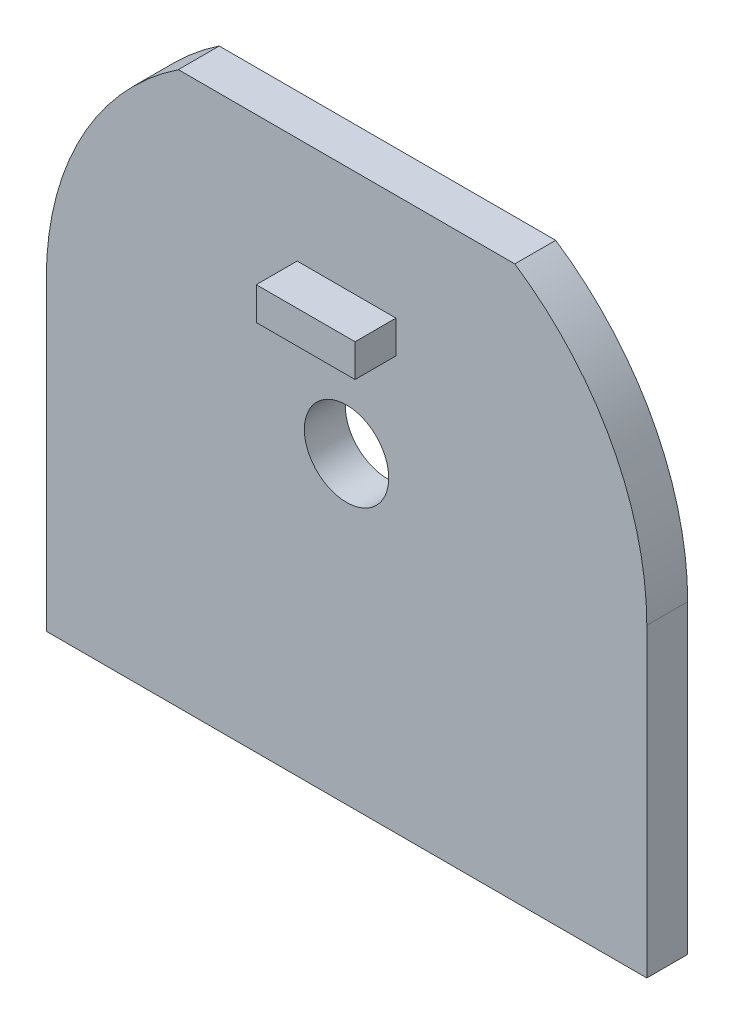
ISO-10303-21;
HEADER;
FILE_DESCRIPTION(('STEP AP214'),'2;1');
FILE_NAME('part.step','',(''),(''),'','','');
FILE_SCHEMA(('AUTOMOTIVE_DESIGN { 1 0 10303 214 1 1 1 1 }'));
ENDSEC;
DATA;
#1=APPLICATION_CONTEXT('core data for automotive mechanical design processes');
#2=APPLICATION_PROTOCOL_DEFINITION('international standard','automotive_design',2000,#1);
#3=PRODUCT_CONTEXT('',#1,'mechanical');
#4=PRODUCT('Part','Part','',(#3));
#5=PRODUCT_RELATED_PRODUCT_CATEGORY('part','',(#4));
#6=PRODUCT_DEFINITION_FORMATION('','',#4);
#7=PRODUCT_DEFINITION_CONTEXT('part definition',#1,'design');
#8=PRODUCT_DEFINITION('design','',#6,#7);
#9=PRODUCT_DEFINITION_SHAPE('','',#8);
#10=(LENGTH_UNIT() NAMED_UNIT(*) SI_UNIT(.MILLI.,.METRE.));
#11=(NAMED_UNIT(*) PLANE_ANGLE_UNIT() SI_UNIT($,.RADIAN.));
#12=(NAMED_UNIT(*) SI_UNIT($,.STERADIAN.) SOLID_ANGLE_UNIT());
#13=UNCERTAINTY_MEASURE_WITH_UNIT(LENGTH_MEASURE(1.E-05),#10,'distance_accuracy_value','');
#14=(GEOMETRIC_REPRESENTATION_CONTEXT(3) GLOBAL_UNCERTAINTY_ASSIGNED_CONTEXT((#13)) GLOBAL_UNIT_ASSIGNED_CONTEXT((#10,
#11,#12)) REPRESENTATION_CONTEXT('',''));
#15=CARTESIAN_POINT('',(0.,0.,0.));
#16=DIRECTION('',(0.,0.,1.));
#17=DIRECTION('',(1.,0.,0.));
#18=AXIS2_PLACEMENT_3D('',#15,#16,#17);
#19=CARTESIAN_POINT('',(-0.0614645717185849,0.599999941999997,0.79));
#20=DIRECTION('',(0.,0.,-1.));
#21=DIRECTION('',(-1.,0.,0.));
#22=AXIS2_PLACEMENT_3D('',#19,#20,#21);
#23=PLANE('',#22);
#24=CARTESIAN_POINT('',(0.,0.57116650110339,0.79));
#25=DIRECTION('',(0.,0.,1.));
#26=DIRECTION('',(1.,0.,0.));
#27=AXIS2_PLACEMENT_3D('',#24,#25,#26);
#28=CIRCLE('',#27,0.815000000000001);
#29=CARTESIAN_POINT('',(-0.815000000000001,0.57116650110339,0.79));
#30=VERTEX_POINT('',#29);
#31=EDGE_CURVE('E146',#30,#30,#28,.T.);
#32=ORIENTED_EDGE('',*,*,#31,.F.);
#33=EDGE_LOOP('',(#32));
#34=FACE_BOUND('',#33,.T.);
#35=DIRECTION('',(0.,1.,0.));
#36=VECTOR('',#35,1.);
#37=CARTESIAN_POINT('',(5.8,0.599999941999998,0.79));
#38=LINE('',#37,#36);
#39=CARTESIAN_POINT('',(5.8,-5.299999942,0.79));
#40=VERTEX_POINT('',#39);
#41=CARTESIAN_POINT('',(5.8,0.599999941999998,0.79));
#42=VERTEX_POINT('',#41);
#43=EDGE_CURVE('E156',#40,#42,#38,.T.);
#44=ORIENTED_EDGE('',*,*,#43,.T.);
#45=CARTESIAN_POINT('',(0.0614645717185833,0.599999941999997,0.79));
#46=DIRECTION('',(0.,0.,1.));
#47=DIRECTION('',(1.,0.,0.));
#48=AXIS2_PLACEMENT_3D('',#45,#46,#47);
#49=CIRCLE('',#48,5.73853542828142);
#50=CARTESIAN_POINT('',(3.249999977,5.37116655310339,0.79));
#51=VERTEX_POINT('',#50);
#52=EDGE_CURVE('E160',#42,#51,#49,.T.);
#53=ORIENTED_EDGE('',*,*,#52,.T.);
#54=DIRECTION('',(-1.,0.,0.));
#55=VECTOR('',#54,1.);
#56=CARTESIAN_POINT('',(-3.249999977,5.37116655310339,0.79));
#57=LINE('',#56,#55);
#58=CARTESIAN_POINT('',(-3.249999977,5.37116655310339,0.79));
#59=VERTEX_POINT('',#58);
#60=EDGE_CURVE('E164',#51,#59,#57,.T.);
#61=ORIENTED_EDGE('',*,*,#60,.T.);
#62=CARTESIAN_POINT('',(-0.0614645717185849,0.599999941999997,0.79));
#63=DIRECTION('',(0.,0.,1.));
#64=DIRECTION('',(-1.,0.,0.));
#65=AXIS2_PLACEMENT_3D('',#62,#63,#64);
#66=CIRCLE('',#65,5.73853542828142);
#67=CARTESIAN_POINT('',(-5.8,0.599999941999997,0.79));
#68=VERTEX_POINT('',#67);
#69=EDGE_CURVE('E167',#59,#68,#66,.T.);
#70=ORIENTED_EDGE('',*,*,#69,.T.);
#71=DIRECTION('',(0.,-1.,0.));
#72=VECTOR('',#71,1.);
#73=CARTESIAN_POINT('',(-5.8,0.599999941999997,0.79));
#74=LINE('',#73,#72);
#75=CARTESIAN_POINT('',(-5.8,-5.299999942,0.79));
#76=VERTEX_POINT('',#75);
#77=EDGE_CURVE('E170',#68,#76,#74,.T.);
#78=ORIENTED_EDGE('',*,*,#77,.T.);
#79=DIRECTION('',(1.,0.,0.));
#80=VECTOR('',#79,1.);
#81=CARTESIAN_POINT('',(5.8,-5.299999942,0.79));
#82=LINE('',#81,#80);
#83=EDGE_CURVE('E173',#76,#40,#82,.T.);
#84=ORIENTED_EDGE('',*,*,#83,.T.);
#85=EDGE_LOOP('',(#44,#53,#61,#70,#78,#84));
#86=FACE_BOUND('',#85,.T.);
#87=DIRECTION('',(0.,1.,0.));
#88=VECTOR('',#87,1.);
#89=CARTESIAN_POINT('',(0.954050135205686,2.68359858522657,0.79));
#90=LINE('',#89,#88);
#91=CARTESIAN_POINT('',(0.954050135205686,2.68359858522657,0.79));
#92=VERTEX_POINT('',#91);
#93=CARTESIAN_POINT('',(0.954050135205687,3.31640141477343,0.79));
#94=VERTEX_POINT('',#93);
#95=EDGE_CURVE('E139',#92,#94,#90,.T.);
#96=ORIENTED_EDGE('',*,*,#95,.F.);
#97=DIRECTION('',(1.,0.,0.));
#98=VECTOR('',#97,1.);
#99=CARTESIAN_POINT('',(-0.954050135205687,2.68359858522657,0.79));
#100=LINE('',#99,#98);
#101=CARTESIAN_POINT('',(-0.954050135205687,2.68359858522657,0.79));
#102=VERTEX_POINT('',#101);
#103=EDGE_CURVE('E136',#102,#92,#100,.T.);
#104=ORIENTED_EDGE('',*,*,#103,.F.);
#105=DIRECTION('',(0.,-1.,0.));
#106=VECTOR('',#105,1.);
#107=CARTESIAN_POINT('',(-0.954050135205687,2.68359858522657,0.79));
#108=LINE('',#107,#106);
#109=CARTESIAN_POINT('',(-0.954050135205687,3.31640141477343,0.79));
#110=VERTEX_POINT('',#109);
#111=EDGE_CURVE('E60',#110,#102,#108,.T.);
#112=ORIENTED_EDGE('',*,*,#111,.F.);
#113=DIRECTION('',(-1.,0.,0.));
#114=VECTOR('',#113,1.);
#115=CARTESIAN_POINT('',(-0.954050135205687,3.31640141477343,0.79));
#116=LINE('',#115,#114);
#117=EDGE_CURVE('E55',#94,#110,#116,.T.);
#118=ORIENTED_EDGE('',*,*,#117,.F.);
#119=EDGE_LOOP('',(#96,#104,#112,#118));
#120=FACE_BOUND('',#119,.T.);
#121=ADVANCED_FACE('F39',(#34,#86,#120),#23,.F.);
#122=CARTESIAN_POINT('',(-0.0614645717185849,0.599999941999997,0.));
#123=DIRECTION('',(0.,0.,-1.));
#124=DIRECTION('',(-1.,0.,0.));
#125=AXIS2_PLACEMENT_3D('',#122,#123,#124);
#126=PLANE('',#125);
#127=DIRECTION('',(0.,1.,0.));
#128=VECTOR('',#127,1.);
#129=CARTESIAN_POINT('',(5.8,0.599999941999998,0.));
#130=LINE('',#129,#128);
#131=CARTESIAN_POINT('',(5.8,-5.299999942,0.));
#132=VERTEX_POINT('',#131);
#133=CARTESIAN_POINT('',(5.8,0.599999941999998,0.));
#134=VERTEX_POINT('',#133);
#135=EDGE_CURVE('E154',#132,#134,#130,.T.);
#136=ORIENTED_EDGE('',*,*,#135,.F.);
#137=DIRECTION('',(1.,0.,0.));
#138=VECTOR('',#137,1.);
#139=CARTESIAN_POINT('',(5.8,-5.299999942,0.));
#140=LINE('',#139,#138);
#141=CARTESIAN_POINT('',(-5.8,-5.299999942,0.));
#142=VERTEX_POINT('',#141);
#143=EDGE_CURVE('E161',#142,#132,#140,.T.);
#144=ORIENTED_EDGE('',*,*,#143,.F.);
#145=DIRECTION('',(0.,-1.,0.));
#146=VECTOR('',#145,1.);
#147=CARTESIAN_POINT('',(-5.8,0.599999941999997,0.));
#148=LINE('',#147,#146);
#149=CARTESIAN_POINT('',(-5.8,0.599999941999997,0.));
#150=VERTEX_POINT('',#149);
#151=EDGE_CURVE('E189',#150,#142,#148,.T.);
#152=ORIENTED_EDGE('',*,*,#151,.F.);
#153=CARTESIAN_POINT('',(-0.0614645717185849,0.599999941999997,0.));
#154=DIRECTION('',(0.,0.,1.));
#155=DIRECTION('',(-1.,0.,0.));
#156=AXIS2_PLACEMENT_3D('',#153,#154,#155);
#157=CIRCLE('',#156,5.73853542828142);
#158=CARTESIAN_POINT('',(-3.249999977,5.37116655310339,0.));
#159=VERTEX_POINT('',#158);
#160=EDGE_CURVE('E186',#159,#150,#157,.T.);
#161=ORIENTED_EDGE('',*,*,#160,.F.);
#162=DIRECTION('',(-1.,0.,0.));
#163=VECTOR('',#162,1.);
#164=CARTESIAN_POINT('',(-3.249999977,5.37116655310339,0.));
#165=LINE('',#164,#163);
#166=CARTESIAN_POINT('',(3.249999977,5.37116655310339,0.));
#167=VERTEX_POINT('',#166);
#168=EDGE_CURVE('E183',#167,#159,#165,.T.);
#169=ORIENTED_EDGE('',*,*,#168,.F.);
#170=CARTESIAN_POINT('',(0.0614645717185833,0.599999941999997,0.));
#171=DIRECTION('',(0.,0.,1.));
#172=DIRECTION('',(1.,0.,0.));
#173=AXIS2_PLACEMENT_3D('',#170,#171,#172);
#174=CIRCLE('',#173,5.73853542828142);
#175=EDGE_CURVE('E180',#134,#167,#174,.T.);
#176=ORIENTED_EDGE('',*,*,#175,.F.);
#177=EDGE_LOOP('',(#136,#144,#152,#161,#169,#176));
#178=FACE_BOUND('',#177,.T.);
#179=CARTESIAN_POINT('',(0.,0.57116650110339,0.));
#180=DIRECTION('',(0.,0.,1.));
#181=DIRECTION('',(1.,0.,0.));
#182=AXIS2_PLACEMENT_3D('',#179,#180,#181);
#183=CIRCLE('',#182,0.815000000000001);
#184=CARTESIAN_POINT('',(-0.815000000000001,0.57116650110339,0.));
#185=VERTEX_POINT('',#184);
#186=EDGE_CURVE('E141',#185,#185,#183,.T.);
#187=ORIENTED_EDGE('',*,*,#186,.T.);
#188=EDGE_LOOP('',(#187));
#189=FACE_BOUND('',#188,.T.);
#190=ADVANCED_FACE('F220',(#178,#189),#126,.T.);
#191=CARTESIAN_POINT('',(5.8,0.599999941999998,0.79));
#192=DIRECTION('',(-1.,0.,0.));
#193=DIRECTION('',(0.,-1.,0.));
#194=AXIS2_PLACEMENT_3D('',#191,#192,#193);
#195=PLANE('',#194);
#196=ORIENTED_EDGE('',*,*,#135,.T.);
#197=DIRECTION('',(0.,0.,-1.));
#198=VECTOR('',#197,1.);
#199=CARTESIAN_POINT('',(5.8,0.599999941999998,0.79));
#200=LINE('',#199,#198);
#201=EDGE_CURVE('E11',#42,#134,#200,.T.);
#202=ORIENTED_EDGE('',*,*,#201,.F.);
#203=ORIENTED_EDGE('',*,*,#43,.F.);
#204=DIRECTION('',(0.,0.,-1.));
#205=VECTOR('',#204,1.);
#206=CARTESIAN_POINT('',(5.8,-5.299999942,0.79));
#207=LINE('',#206,#205);
#208=EDGE_CURVE('E176',#40,#132,#207,.T.);
#209=ORIENTED_EDGE('',*,*,#208,.T.);
#210=EDGE_LOOP('',(#196,#202,#203,#209));
#211=FACE_BOUND('',#210,.T.);
#212=ADVANCED_FACE('F41',(#211),#195,.F.);
#213=CARTESIAN_POINT('',(0.0614645717185833,0.599999941999997,0.79));
#214=DIRECTION('',(0.,0.,-1.));
#215=DIRECTION('',(-1.,0.,0.));
#216=AXIS2_PLACEMENT_3D('',#213,#214,#215);
#217=CYLINDRICAL_SURFACE('',#216,5.73853542828142);
#218=ORIENTED_EDGE('',*,*,#175,.T.);
#219=DIRECTION('',(0.,0.,-1.));
#220=VECTOR('',#219,1.);
#221=CARTESIAN_POINT('',(3.249999977,5.37116655310339,0.79));
#222=LINE('',#221,#220);
#223=EDGE_CURVE('E48',#51,#167,#222,.T.);
#224=ORIENTED_EDGE('',*,*,#223,.F.);
#225=ORIENTED_EDGE('',*,*,#52,.F.);
#226=ORIENTED_EDGE('',*,*,#201,.T.);
#227=EDGE_LOOP('',(#218,#224,#225,#226));
#228=FACE_BOUND('',#227,.T.);
#229=ADVANCED_FACE('F237',(#228),#217,.T.);
#230=CARTESIAN_POINT('',(-3.249999977,5.37116655310339,0.79));
#231=DIRECTION('',(0.,-1.,0.));
#232=DIRECTION('',(0.,0.,-1.));
#233=AXIS2_PLACEMENT_3D('',#230,#231,#232);
#234=PLANE('',#233);
#235=ORIENTED_EDGE('',*,*,#168,.T.);
#236=DIRECTION('',(0.,0.,-1.));
#237=VECTOR('',#236,1.);
#238=CARTESIAN_POINT('',(-3.249999977,5.37116655310339,0.79));
#239=LINE('',#238,#237);
#240=EDGE_CURVE('E205',#59,#159,#239,.T.);
#241=ORIENTED_EDGE('',*,*,#240,.F.);
#242=ORIENTED_EDGE('',*,*,#60,.F.);
#243=ORIENTED_EDGE('',*,*,#223,.T.);
#244=EDGE_LOOP('',(#235,#241,#242,#243));
#245=FACE_BOUND('',#244,.T.);
#246=ADVANCED_FACE('F214',(#245),#234,.F.);
#247=CARTESIAN_POINT('',(-0.0614645717185849,0.599999941999997,0.79));
#248=DIRECTION('',(0.,0.,-1.));
#249=DIRECTION('',(-1.,0.,0.));
#250=AXIS2_PLACEMENT_3D('',#247,#248,#249);
#251=CYLINDRICAL_SURFACE('',#250,5.73853542828142);
#252=ORIENTED_EDGE('',*,*,#160,.T.);
#253=DIRECTION('',(0.,0.,-1.));
#254=VECTOR('',#253,1.);
#255=CARTESIAN_POINT('',(-5.8,0.599999941999997,0.79));
#256=LINE('',#255,#254);
#257=EDGE_CURVE('E201',#68,#150,#256,.T.);
#258=ORIENTED_EDGE('',*,*,#257,.F.);
#259=ORIENTED_EDGE('',*,*,#69,.F.);
#260=ORIENTED_EDGE('',*,*,#240,.T.);
#261=EDGE_LOOP('',(#252,#258,#259,#260));
#262=FACE_BOUND('',#261,.T.);
#263=ADVANCED_FACE('F226',(#262),#251,.T.);
#264=CARTESIAN_POINT('',(-5.8,0.599999941999997,0.79));
#265=DIRECTION('',(1.,0.,0.));
#266=DIRECTION('',(0.,1.,0.));
#267=AXIS2_PLACEMENT_3D('',#264,#265,#266);
#268=PLANE('',#267);
#269=ORIENTED_EDGE('',*,*,#151,.T.);
#270=DIRECTION('',(0.,0.,-1.));
#271=VECTOR('',#270,1.);
#272=CARTESIAN_POINT('',(-5.8,-5.299999942,0.79));
#273=LINE('',#272,#271);
#274=EDGE_CURVE('E197',#76,#142,#273,.T.);
#275=ORIENTED_EDGE('',*,*,#274,.F.);
#276=ORIENTED_EDGE('',*,*,#77,.F.);
#277=ORIENTED_EDGE('',*,*,#257,.T.);
#278=EDGE_LOOP('',(#269,#275,#276,#277));
#279=FACE_BOUND('',#278,.T.);
#280=ADVANCED_FACE('F230',(#279),#268,.F.);
#281=CARTESIAN_POINT('',(5.8,-5.299999942,0.79));
#282=DIRECTION('',(0.,1.,0.));
#283=DIRECTION('',(-1.,0.,0.));
#284=AXIS2_PLACEMENT_3D('',#281,#282,#283);
#285=PLANE('',#284);
#286=ORIENTED_EDGE('',*,*,#143,.T.);
#287=ORIENTED_EDGE('',*,*,#208,.F.);
#288=ORIENTED_EDGE('',*,*,#83,.F.);
#289=ORIENTED_EDGE('',*,*,#274,.T.);
#290=EDGE_LOOP('',(#286,#287,#288,#289));
#291=FACE_BOUND('',#290,.T.);
#292=ADVANCED_FACE('F240',(#291),#285,.F.);
#293=CARTESIAN_POINT('',(0.,0.57116650110339,0.79));
#294=DIRECTION('',(0.,0.,-1.));
#295=DIRECTION('',(-1.,0.,0.));
#296=AXIS2_PLACEMENT_3D('',#293,#294,#295);
#297=CYLINDRICAL_SURFACE('',#296,0.815000000000001);
#298=CARTESIAN_POINT('',(-0.815000000000001,0.57116650110339,0.79));
#299=CARTESIAN_POINT('',(-0.815000000000001,0.57116650110339,0.781770833333333));
#300=CARTESIAN_POINT('',(-0.815000000000001,0.57116650110339,0.773541666666667));
#301=CARTESIAN_POINT('',(-0.815000000000001,0.57116650110339,0.757083333333333));
#302=CARTESIAN_POINT('',(-0.815000000000001,0.57116650110339,0.748854166666667));
#303=CARTESIAN_POINT('',(-0.815000000000001,0.57116650110339,0.732395833333333));
#304=CARTESIAN_POINT('',(-0.815000000000001,0.57116650110339,0.724166666666667));
#305=CARTESIAN_POINT('',(-0.815000000000001,0.57116650110339,0.707708333333333));
#306=CARTESIAN_POINT('',(-0.815000000000001,0.57116650110339,0.699479166666667));
#307=CARTESIAN_POINT('',(-0.815000000000001,0.57116650110339,0.683020833333333));
#308=CARTESIAN_POINT('',(-0.815000000000001,0.57116650110339,0.674791666666667));
#309=CARTESIAN_POINT('',(-0.815000000000001,0.57116650110339,0.658333333333333));
#310=CARTESIAN_POINT('',(-0.815000000000001,0.57116650110339,0.650104166666667));
#311=CARTESIAN_POINT('',(-0.815000000000001,0.57116650110339,0.633645833333333));
#312=CARTESIAN_POINT('',(-0.815000000000001,0.57116650110339,0.625416666666667));
#313=CARTESIAN_POINT('',(-0.815000000000001,0.57116650110339,0.608958333333333));
#314=CARTESIAN_POINT('',(-0.815000000000001,0.57116650110339,0.600729166666667));
#315=CARTESIAN_POINT('',(-0.815000000000001,0.57116650110339,0.584270833333333));
#316=CARTESIAN_POINT('',(-0.815000000000001,0.57116650110339,0.576041666666667));
#317=CARTESIAN_POINT('',(-0.815000000000001,0.57116650110339,0.559583333333333));
#318=CARTESIAN_POINT('',(-0.815000000000001,0.57116650110339,0.551354166666667));
#319=CARTESIAN_POINT('',(-0.815000000000001,0.57116650110339,0.534895833333333));
#320=CARTESIAN_POINT('',(-0.815000000000001,0.57116650110339,0.526666666666667));
#321=CARTESIAN_POINT('',(-0.815000000000001,0.57116650110339,0.510208333333333));
#322=CARTESIAN_POINT('',(-0.815000000000001,0.57116650110339,0.501979166666667));
#323=CARTESIAN_POINT('',(-0.815000000000001,0.57116650110339,0.485520833333333));
#324=CARTESIAN_POINT('',(-0.815000000000001,0.57116650110339,0.477291666666667));
#325=CARTESIAN_POINT('',(-0.815000000000001,0.57116650110339,0.460833333333333));
#326=CARTESIAN_POINT('',(-0.815000000000001,0.57116650110339,0.452604166666667));
#327=CARTESIAN_POINT('',(-0.815000000000001,0.57116650110339,0.436145833333333));
#328=CARTESIAN_POINT('',(-0.815000000000001,0.57116650110339,0.427916666666667));
#329=CARTESIAN_POINT('',(-0.815000000000001,0.57116650110339,0.411458333333333));
#330=CARTESIAN_POINT('',(-0.815000000000001,0.57116650110339,0.403229166666667));
#331=CARTESIAN_POINT('',(-0.815000000000001,0.57116650110339,0.386770833333333));
#332=CARTESIAN_POINT('',(-0.815000000000001,0.57116650110339,0.378541666666667));
#333=CARTESIAN_POINT('',(-0.815000000000001,0.57116650110339,0.362083333333333));
#334=CARTESIAN_POINT('',(-0.815000000000001,0.57116650110339,0.353854166666667));
#335=CARTESIAN_POINT('',(-0.815000000000001,0.57116650110339,0.337395833333333));
#336=CARTESIAN_POINT('',(-0.815000000000001,0.57116650110339,0.329166666666667));
#337=CARTESIAN_POINT('',(-0.815000000000001,0.57116650110339,0.312708333333333));
#338=CARTESIAN_POINT('',(-0.815000000000001,0.57116650110339,0.304479166666667));
#339=CARTESIAN_POINT('',(-0.815000000000001,0.57116650110339,0.288020833333333));
#340=CARTESIAN_POINT('',(-0.815000000000001,0.57116650110339,0.279791666666667));
#341=CARTESIAN_POINT('',(-0.815000000000001,0.57116650110339,0.263333333333333));
#342=CARTESIAN_POINT('',(-0.815000000000001,0.57116650110339,0.255104166666667));
#343=CARTESIAN_POINT('',(-0.815000000000001,0.57116650110339,0.238645833333333));
#344=CARTESIAN_POINT('',(-0.815000000000001,0.57116650110339,0.230416666666667));
#345=CARTESIAN_POINT('',(-0.815000000000001,0.57116650110339,0.213958333333333));
#346=CARTESIAN_POINT('',(-0.815000000000001,0.57116650110339,0.205729166666667));
#347=CARTESIAN_POINT('',(-0.815000000000001,0.57116650110339,0.189270833333333));
#348=CARTESIAN_POINT('',(-0.815000000000001,0.57116650110339,0.181041666666667));
#349=CARTESIAN_POINT('',(-0.815000000000001,0.57116650110339,0.164583333333333));
#350=CARTESIAN_POINT('',(-0.815000000000001,0.57116650110339,0.156354166666667));
#351=CARTESIAN_POINT('',(-0.815000000000001,0.57116650110339,0.139895833333333));
#352=CARTESIAN_POINT('',(-0.815000000000001,0.57116650110339,0.131666666666667));
#353=CARTESIAN_POINT('',(-0.815000000000001,0.57116650110339,0.115208333333333));
#354=CARTESIAN_POINT('',(-0.815000000000001,0.57116650110339,0.106979166666667));
#355=CARTESIAN_POINT('',(-0.815000000000001,0.57116650110339,0.0905208333333333));
#356=CARTESIAN_POINT('',(-0.815000000000001,0.57116650110339,0.0822916666666667));
#357=CARTESIAN_POINT('',(-0.815000000000001,0.57116650110339,0.0658333333333334));
#358=CARTESIAN_POINT('',(-0.815000000000001,0.57116650110339,0.0576041666666667));
#359=CARTESIAN_POINT('',(-0.815000000000001,0.57116650110339,0.0411458333333334));
#360=CARTESIAN_POINT('',(-0.815000000000001,0.57116650110339,0.0329166666666667));
#361=CARTESIAN_POINT('',(-0.815000000000001,0.57116650110339,0.0164583333333333));
#362=CARTESIAN_POINT('',(-0.815000000000001,0.57116650110339,0.00822916666666665));
#363=CARTESIAN_POINT('',(-0.815000000000001,0.57116650110339,0.));
#364=B_SPLINE_CURVE_WITH_KNOTS('',3,(#298,#299,#300,#301,#302,#303,#304,#305,#306,#307,#308,
#309,#310,#311,#312,#313,#314,#315,#316,#317,#318,#319,#320,#321,#322,#323,#324,#325,#326,#327,
#328,#329,#330,#331,#332,#333,#334,#335,#336,#337,#338,#339,#340,#341,#342,#343,#344,#345,#346,
#347,#348,#349,#350,#351,#352,#353,#354,#355,#356,#357,#358,#359,#360,#361,#362,#363),
.UNSPECIFIED.,.F.,.F.,(4,2,2,2,2,2,2,2,2,2,2,2,2,2,2,2,2,2,2,2,2,2,2,2,2,2,2,2,2,2,2,2,4),(0.,
0.0246875000000001,0.0493750000000001,0.0740625,0.0987500000000001,0.1234375,0.148125,0.1728125,
0.1975,0.2221875,0.246875,0.2715625,0.29625,0.3209375,0.345625,0.3703125,0.395,0.4196875,
0.444375,0.4690625,0.49375,0.5184375,0.543125,0.5678125,0.5925,0.6171875,0.641875,0.6665625,
0.69125,0.7159375,0.740625,0.7653125,0.79),.UNSPECIFIED.);
#365=EDGE_CURVE('BSEAM242',#30,#185,#364,.T.);
#366=ORIENTED_EDGE('',*,*,#31,.T.);
#367=ORIENTED_EDGE('',*,*,#186,.F.);
#368=ORIENTED_EDGE('',*,*,#365,.T.);
#369=ORIENTED_EDGE('',*,*,#365,.F.);
#370=EDGE_LOOP('',(#366,#368,#367,#369));
#371=FACE_BOUND('',#370,.T.);
#372=ADVANCED_FACE('F242',(#371),#297,.F.);
#373=CARTESIAN_POINT('',(0.954050135205686,2.68359858522657,1.58));
#374=DIRECTION('',(-1.,0.,0.));
#375=DIRECTION('',(0.,-1.,0.));
#376=AXIS2_PLACEMENT_3D('',#373,#374,#375);
#377=PLANE('',#376);
#378=ORIENTED_EDGE('',*,*,#95,.T.);
#379=DIRECTION('',(0.,0.,-1.));
#380=VECTOR('',#379,1.);
#381=CARTESIAN_POINT('',(0.954050135205686,3.31640141477343,1.58));
#382=LINE('',#381,#380);
#383=CARTESIAN_POINT('',(0.954050135205686,3.31640141477343,1.58));
#384=VERTEX_POINT('',#383);
#385=EDGE_CURVE('E118',#384,#94,#382,.T.);
#386=ORIENTED_EDGE('',*,*,#385,.F.);
#387=DIRECTION('',(0.,1.,0.));
#388=VECTOR('',#387,1.);
#389=CARTESIAN_POINT('',(0.954050135205686,2.68359858522657,1.58));
#390=LINE('',#389,#388);
#391=CARTESIAN_POINT('',(0.954050135205686,2.68359858522657,1.58));
#392=VERTEX_POINT('',#391);
#393=EDGE_CURVE('E126',#392,#384,#390,.T.);
#394=ORIENTED_EDGE('',*,*,#393,.F.);
#395=DIRECTION('',(0.,0.,-1.));
#396=VECTOR('',#395,1.);
#397=CARTESIAN_POINT('',(0.954050135205686,2.68359858522657,1.58));
#398=LINE('',#397,#396);
#399=EDGE_CURVE('E361',#392,#92,#398,.T.);
#400=ORIENTED_EDGE('',*,*,#399,.T.);
#401=EDGE_LOOP('',(#378,#386,#394,#400));
#402=FACE_BOUND('',#401,.T.);
#403=ADVANCED_FACE('F138',(#402),#377,.F.);
#404=CARTESIAN_POINT('',(-0.954050135205687,3.31640141477343,1.58));
#405=DIRECTION('',(0.,-1.,0.));
#406=DIRECTION('',(0.,0.,-1.));
#407=AXIS2_PLACEMENT_3D('',#404,#405,#406);
#408=PLANE('',#407);
#409=ORIENTED_EDGE('',*,*,#117,.T.);
#410=DIRECTION('',(0.,0.,-1.));
#411=VECTOR('',#410,1.);
#412=CARTESIAN_POINT('',(-0.954050135205687,3.31640141477343,1.58));
#413=LINE('',#412,#411);
#414=CARTESIAN_POINT('',(-0.954050135205687,3.31640141477343,1.58));
#415=VERTEX_POINT('',#414);
#416=EDGE_CURVE('E121',#415,#110,#413,.T.);
#417=ORIENTED_EDGE('',*,*,#416,.F.);
#418=DIRECTION('',(-1.,0.,0.));
#419=VECTOR('',#418,1.);
#420=CARTESIAN_POINT('',(-0.954050135205687,3.31640141477343,1.58));
#421=LINE('',#420,#419);
#422=EDGE_CURVE('E114',#384,#415,#421,.T.);
#423=ORIENTED_EDGE('',*,*,#422,.F.);
#424=ORIENTED_EDGE('',*,*,#385,.T.);
#425=EDGE_LOOP('',(#409,#417,#423,#424));
#426=FACE_BOUND('',#425,.T.);
#427=ADVANCED_FACE('F116',(#426),#408,.F.);
#428=CARTESIAN_POINT('',(-0.954050135205687,2.68359858522657,1.58));
#429=DIRECTION('',(1.,0.,0.));
#430=DIRECTION('',(0.,0.,-1.));
#431=AXIS2_PLACEMENT_3D('',#428,#429,#430);
#432=PLANE('',#431);
#433=ORIENTED_EDGE('',*,*,#111,.T.);
#434=DIRECTION('',(0.,0.,-1.));
#435=VECTOR('',#434,1.);
#436=CARTESIAN_POINT('',(-0.954050135205687,2.68359858522657,1.58));
#437=LINE('',#436,#435);
#438=CARTESIAN_POINT('',(-0.954050135205687,2.68359858522657,1.58));
#439=VERTEX_POINT('',#438);
#440=EDGE_CURVE('E148',#439,#102,#437,.T.);
#441=ORIENTED_EDGE('',*,*,#440,.F.);
#442=DIRECTION('',(0.,-1.,0.));
#443=VECTOR('',#442,1.);
#444=CARTESIAN_POINT('',(-0.954050135205687,2.68359858522657,1.58));
#445=LINE('',#444,#443);
#446=EDGE_CURVE('E125',#415,#439,#445,.T.);
#447=ORIENTED_EDGE('',*,*,#446,.F.);
#448=ORIENTED_EDGE('',*,*,#416,.T.);
#449=EDGE_LOOP('',(#433,#441,#447,#448));
#450=FACE_BOUND('',#449,.T.);
#451=ADVANCED_FACE('F264',(#450),#432,.F.);
#452=CARTESIAN_POINT('',(-0.954050135205687,2.68359858522657,1.58));
#453=DIRECTION('',(0.,1.,0.));
#454=DIRECTION('',(0.,0.,1.));
#455=AXIS2_PLACEMENT_3D('',#452,#453,#454);
#456=PLANE('',#455);
#457=ORIENTED_EDGE('',*,*,#103,.T.);
#458=ORIENTED_EDGE('',*,*,#399,.F.);
#459=DIRECTION('',(1.,0.,0.));
#460=VECTOR('',#459,1.);
#461=CARTESIAN_POINT('',(-0.954050135205687,2.68359858522657,1.58));
#462=LINE('',#461,#460);
#463=EDGE_CURVE('E131',#439,#392,#462,.T.);
#464=ORIENTED_EDGE('',*,*,#463,.F.);
#465=ORIENTED_EDGE('',*,*,#440,.T.);
#466=EDGE_LOOP('',(#457,#458,#464,#465));
#467=FACE_BOUND('',#466,.T.);
#468=ADVANCED_FACE('F267',(#467),#456,.F.);
#469=CARTESIAN_POINT('',(0.,0.,1.58));
#470=DIRECTION('',(0.,0.,-1.));
#471=DIRECTION('',(-1.,0.,0.));
#472=AXIS2_PLACEMENT_3D('',#469,#470,#471);
#473=PLANE('',#472);
#474=ORIENTED_EDGE('',*,*,#393,.T.);
#475=ORIENTED_EDGE('',*,*,#422,.T.);
#476=ORIENTED_EDGE('',*,*,#446,.T.);
#477=ORIENTED_EDGE('',*,*,#463,.T.);
#478=EDGE_LOOP('',(#474,#475,#476,#477));
#479=FACE_BOUND('',#478,.T.);
#480=ADVANCED_FACE('F129',(#479),#473,.F.);
#481=CLOSED_SHELL('',(#121,#190,#212,#229,#246,#263,#280,#292,#372,#403,#427,#451,#468,#480));
#482=MANIFOLD_SOLID_BREP('B2',#481);
#483=ADVANCED_BREP_SHAPE_REPRESENTATION('',(#18,#482),#14);
#484=SHAPE_DEFINITION_REPRESENTATION(#9,#483);
ENDSEC;
END-ISO-10303-21;
